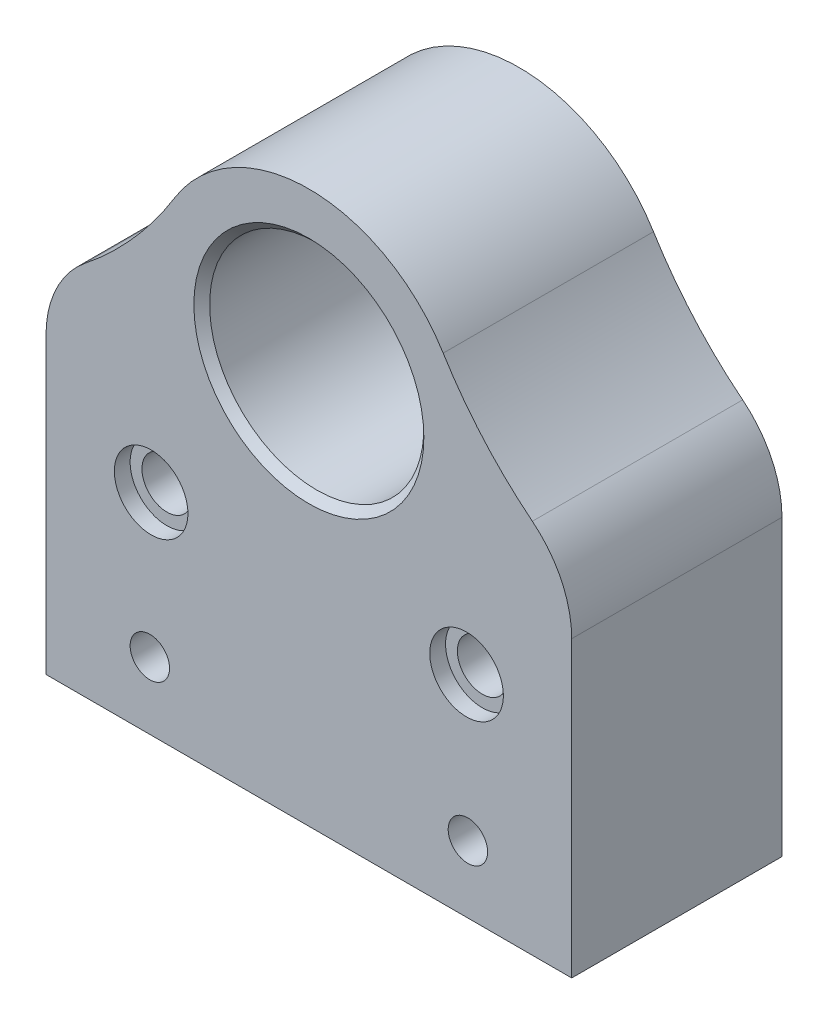
ISO-10303-21;
HEADER;
FILE_DESCRIPTION(('STEP AP214'),'2;1');
FILE_NAME('part.step','',(''),(''),'','','');
FILE_SCHEMA(('AUTOMOTIVE_DESIGN { 1 0 10303 214 1 1 1 1 }'));
ENDSEC;
DATA;
#1=APPLICATION_CONTEXT('core data for automotive mechanical design processes');
#2=APPLICATION_PROTOCOL_DEFINITION('international standard','automotive_design',2000,#1);
#3=PRODUCT_CONTEXT('',#1,'mechanical');
#4=PRODUCT('Part','Part','',(#3));
#5=PRODUCT_RELATED_PRODUCT_CATEGORY('part','',(#4));
#6=PRODUCT_DEFINITION_FORMATION('','',#4);
#7=PRODUCT_DEFINITION_CONTEXT('part definition',#1,'design');
#8=PRODUCT_DEFINITION('design','',#6,#7);
#9=PRODUCT_DEFINITION_SHAPE('','',#8);
#10=(LENGTH_UNIT() NAMED_UNIT(*) SI_UNIT(.MILLI.,.METRE.));
#11=(NAMED_UNIT(*) PLANE_ANGLE_UNIT() SI_UNIT($,.RADIAN.));
#12=(NAMED_UNIT(*) SI_UNIT($,.STERADIAN.) SOLID_ANGLE_UNIT());
#13=UNCERTAINTY_MEASURE_WITH_UNIT(LENGTH_MEASURE(1.E-05),#10,'distance_accuracy_value','');
#14=(GEOMETRIC_REPRESENTATION_CONTEXT(3) GLOBAL_UNCERTAINTY_ASSIGNED_CONTEXT((#13)) GLOBAL_UNIT_ASSIGNED_CONTEXT((#10,
#11,#12)) REPRESENTATION_CONTEXT('',''));
#15=CARTESIAN_POINT('',(0.,0.,0.));
#16=DIRECTION('',(0.,0.,1.));
#17=DIRECTION('',(1.,0.,0.));
#18=AXIS2_PLACEMENT_3D('',#15,#16,#17);
#19=CARTESIAN_POINT('',(0.,0.,4.8));
#20=DIRECTION('',(0.,0.,-1.));
#21=DIRECTION('',(0.,1.,0.));
#22=AXIS2_PLACEMENT_3D('',#19,#20,#21);
#23=CONICAL_SURFACE('',#22,4.075,0.785398163397446);
#24=CARTESIAN_POINT('',(0.,0.,4.8));
#25=DIRECTION('',(0.,0.,-1.));
#26=DIRECTION('',(0.,1.,0.));
#27=AXIS2_PLACEMENT_3D('',#24,#25,#26);
#28=CIRCLE('',#27,4.075);
#29=CARTESIAN_POINT('',(0.,4.075,4.8));
#30=VERTEX_POINT('',#29);
#31=EDGE_CURVE('E227',#30,#30,#28,.T.);
#32=ORIENTED_EDGE('',*,*,#31,.F.);
#33=EDGE_LOOP('',(#32));
#34=FACE_BOUND('',#33,.T.);
#35=CARTESIAN_POINT('',(0.,0.,4.5));
#36=DIRECTION('',(0.,0.,1.));
#37=DIRECTION('',(0.,1.,0.));
#38=AXIS2_PLACEMENT_3D('',#35,#36,#37);
#39=CIRCLE('',#38,4.375);
#40=CARTESIAN_POINT('',(0.,4.375,4.5));
#41=VERTEX_POINT('',#40);
#42=EDGE_CURVE('E185',#41,#41,#39,.T.);
#43=ORIENTED_EDGE('',*,*,#42,.F.);
#44=EDGE_LOOP('',(#43));
#45=FACE_BOUND('',#44,.T.);
#46=ADVANCED_FACE('F17',(#34,#45),#23,.F.);
#47=CARTESIAN_POINT('',(0.,0.,12.2));
#48=DIRECTION('',(0.,0.,1.));
#49=DIRECTION('',(0.,-1.,0.));
#50=AXIS2_PLACEMENT_3D('',#47,#48,#49);
#51=CONICAL_SURFACE('',#50,4.075,0.785398163397451);
#52=CARTESIAN_POINT('',(0.,0.,12.2));
#53=DIRECTION('',(0.,0.,1.));
#54=DIRECTION('',(0.,-1.,0.));
#55=AXIS2_PLACEMENT_3D('',#52,#53,#54);
#56=CIRCLE('',#55,4.075);
#57=CARTESIAN_POINT('',(0.,-4.075,12.2));
#58=VERTEX_POINT('',#57);
#59=EDGE_CURVE('E246',#58,#58,#56,.T.);
#60=ORIENTED_EDGE('',*,*,#59,.F.);
#61=EDGE_LOOP('',(#60));
#62=FACE_BOUND('',#61,.T.);
#63=CARTESIAN_POINT('',(0.,0.,12.5));
#64=DIRECTION('',(0.,0.,-1.));
#65=DIRECTION('',(0.,-1.,0.));
#66=AXIS2_PLACEMENT_3D('',#63,#64,#65);
#67=CIRCLE('',#66,4.375);
#68=CARTESIAN_POINT('',(0.,-4.375,12.5));
#69=VERTEX_POINT('',#68);
#70=EDGE_CURVE('E251',#69,#69,#67,.T.);
#71=ORIENTED_EDGE('',*,*,#70,.F.);
#72=EDGE_LOOP('',(#71));
#73=FACE_BOUND('',#72,.T.);
#74=ADVANCED_FACE('F374',(#62,#73),#51,.F.);
#75=CARTESIAN_POINT('',(-6.,-3.82101635651144,8.5));
#76=DIRECTION('',(0.,0.,1.));
#77=DIRECTION('',(0.,-1.,0.));
#78=AXIS2_PLACEMENT_3D('',#75,#76,#77);
#79=CYLINDRICAL_SURFACE('',#78,4.);
#80=CARTESIAN_POINT('',(-6.,-3.82101635651145,12.5));
#81=DIRECTION('',(0.,0.,1.));
#82=DIRECTION('',(0.,-1.,0.));
#83=AXIS2_PLACEMENT_3D('',#80,#81,#82);
#84=CIRCLE('',#83,4.);
#85=CARTESIAN_POINT('',(-8.50285133052596,-0.700802386719563,12.5));
#86=VERTEX_POINT('',#85);
#87=CARTESIAN_POINT('',(-10.,-3.82101635651144,12.5));
#88=VERTEX_POINT('',#87);
#89=EDGE_CURVE('E286',#86,#88,#84,.T.);
#90=ORIENTED_EDGE('',*,*,#89,.F.);
#91=DIRECTION('',(0.,0.,1.));
#92=VECTOR('',#91,1.);
#93=CARTESIAN_POINT('',(-8.50285133052596,-0.700802386719565,8.5));
#94=LINE('',#93,#92);
#95=CARTESIAN_POINT('',(-8.50285133052596,-0.700802386719561,4.5));
#96=VERTEX_POINT('',#95);
#97=EDGE_CURVE('E11',#96,#86,#94,.T.);
#98=ORIENTED_EDGE('',*,*,#97,.F.);
#99=CARTESIAN_POINT('',(-6.,-3.82101635651144,4.5));
#100=DIRECTION('',(0.,0.,-1.));
#101=DIRECTION('',(0.,1.,0.));
#102=AXIS2_PLACEMENT_3D('',#99,#100,#101);
#103=CIRCLE('',#102,4.);
#104=CARTESIAN_POINT('',(-10.,-3.82101635651144,4.5));
#105=VERTEX_POINT('',#104);
#106=EDGE_CURVE('E202',#105,#96,#103,.T.);
#107=ORIENTED_EDGE('',*,*,#106,.F.);
#108=DIRECTION('',(0.,0.,-1.));
#109=VECTOR('',#108,1.);
#110=CARTESIAN_POINT('',(-10.,-3.82101635651144,8.5));
#111=LINE('',#110,#109);
#112=EDGE_CURVE('E247',#88,#105,#111,.T.);
#113=ORIENTED_EDGE('',*,*,#112,.F.);
#114=EDGE_LOOP('',(#90,#98,#107,#113));
#115=FACE_BOUND('',#114,.T.);
#116=ADVANCED_FACE('F360',(#115),#79,.T.);
#117=CARTESIAN_POINT('',(6.,-3.82101635651144,8.5));
#118=DIRECTION('',(0.,0.,1.));
#119=DIRECTION('',(0.,-1.,0.));
#120=AXIS2_PLACEMENT_3D('',#117,#118,#119);
#121=CYLINDRICAL_SURFACE('',#120,4.);
#122=CARTESIAN_POINT('',(6.,-3.82101635651144,4.5));
#123=DIRECTION('',(0.,0.,-1.));
#124=DIRECTION('',(0.,1.,0.));
#125=AXIS2_PLACEMENT_3D('',#122,#123,#124);
#126=CIRCLE('',#125,4.);
#127=CARTESIAN_POINT('',(8.50285133052596,-0.700802386719563,4.5));
#128=VERTEX_POINT('',#127);
#129=CARTESIAN_POINT('',(10.,-3.82101635651144,4.5));
#130=VERTEX_POINT('',#129);
#131=EDGE_CURVE('E219',#128,#130,#126,.T.);
#132=ORIENTED_EDGE('',*,*,#131,.F.);
#133=DIRECTION('',(0.,0.,-1.));
#134=VECTOR('',#133,1.);
#135=CARTESIAN_POINT('',(8.50285133052596,-0.700802386719565,8.5));
#136=LINE('',#135,#134);
#137=CARTESIAN_POINT('',(8.50285133052596,-0.700802386719563,12.5));
#138=VERTEX_POINT('',#137);
#139=EDGE_CURVE('E25',#138,#128,#136,.T.);
#140=ORIENTED_EDGE('',*,*,#139,.F.);
#141=CARTESIAN_POINT('',(6.,-3.82101635651145,12.5));
#142=DIRECTION('',(0.,0.,1.));
#143=DIRECTION('',(0.,-1.,0.));
#144=AXIS2_PLACEMENT_3D('',#141,#142,#143);
#145=CIRCLE('',#144,4.);
#146=CARTESIAN_POINT('',(10.,-3.82101635651144,12.5));
#147=VERTEX_POINT('',#146);
#148=EDGE_CURVE('E270',#147,#138,#145,.T.);
#149=ORIENTED_EDGE('',*,*,#148,.F.);
#150=DIRECTION('',(0.,0.,1.));
#151=VECTOR('',#150,1.);
#152=CARTESIAN_POINT('',(10.,-3.82101635651145,12.5));
#153=LINE('',#152,#151);
#154=EDGE_CURVE('E243',#130,#147,#153,.T.);
#155=ORIENTED_EDGE('',*,*,#154,.F.);
#156=EDGE_LOOP('',(#132,#140,#149,#155));
#157=FACE_BOUND('',#156,.T.);
#158=ADVANCED_FACE('F332',(#157),#121,.T.);
#159=CARTESIAN_POINT('',(-17.8885438199983,11.,8.5));
#160=DIRECTION('',(0.,0.,1.));
#161=DIRECTION('',(0.,-1.,0.));
#162=AXIS2_PLACEMENT_3D('',#159,#160,#161);
#163=CYLINDRICAL_SURFACE('',#162,15.);
#164=CARTESIAN_POINT('',(-17.8885438199983,11.,4.5));
#165=DIRECTION('',(0.,0.,1.));
#166=DIRECTION('',(0.,1.,0.));
#167=AXIS2_PLACEMENT_3D('',#164,#165,#166);
#168=CIRCLE('',#167,15.);
#169=CARTESIAN_POINT('',(-5.11101251999952,3.14285714285715,4.5));
#170=VERTEX_POINT('',#169);
#171=EDGE_CURVE('E206',#96,#170,#168,.T.);
#172=ORIENTED_EDGE('',*,*,#171,.F.);
#173=ORIENTED_EDGE('',*,*,#97,.T.);
#174=CARTESIAN_POINT('',(-17.8885438199983,11.,12.5));
#175=DIRECTION('',(0.,0.,-1.));
#176=DIRECTION('',(0.,-1.,0.));
#177=AXIS2_PLACEMENT_3D('',#174,#175,#176);
#178=CIRCLE('',#177,15.);
#179=CARTESIAN_POINT('',(-5.11101251999952,3.14285714285715,12.5));
#180=VERTEX_POINT('',#179);
#181=EDGE_CURVE('E282',#180,#86,#178,.T.);
#182=ORIENTED_EDGE('',*,*,#181,.F.);
#183=DIRECTION('',(0.,0.,1.));
#184=VECTOR('',#183,1.);
#185=CARTESIAN_POINT('',(-5.11101251999952,3.14285714285715,8.5));
#186=LINE('',#185,#184);
#187=EDGE_CURVE('E226',#170,#180,#186,.T.);
#188=ORIENTED_EDGE('',*,*,#187,.F.);
#189=EDGE_LOOP('',(#172,#173,#182,#188));
#190=FACE_BOUND('',#189,.T.);
#191=ADVANCED_FACE('F362',(#190),#163,.F.);
#192=CARTESIAN_POINT('',(17.8885438199983,11.,8.5));
#193=DIRECTION('',(0.,0.,1.));
#194=DIRECTION('',(0.,-1.,0.));
#195=AXIS2_PLACEMENT_3D('',#192,#193,#194);
#196=CYLINDRICAL_SURFACE('',#195,15.);
#197=CARTESIAN_POINT('',(17.8885438199983,11.,12.5));
#198=DIRECTION('',(0.,0.,-1.));
#199=DIRECTION('',(0.,-1.,0.));
#200=AXIS2_PLACEMENT_3D('',#197,#198,#199);
#201=CIRCLE('',#200,15.);
#202=CARTESIAN_POINT('',(5.11101251999952,3.14285714285715,12.5));
#203=VERTEX_POINT('',#202);
#204=EDGE_CURVE('E274',#138,#203,#201,.T.);
#205=ORIENTED_EDGE('',*,*,#204,.F.);
#206=ORIENTED_EDGE('',*,*,#139,.T.);
#207=CARTESIAN_POINT('',(17.8885438199983,11.,4.5));
#208=DIRECTION('',(0.,0.,1.));
#209=DIRECTION('',(0.,1.,0.));
#210=AXIS2_PLACEMENT_3D('',#207,#208,#209);
#211=CIRCLE('',#210,15.);
#212=CARTESIAN_POINT('',(5.11101251999952,3.14285714285715,4.5));
#213=VERTEX_POINT('',#212);
#214=EDGE_CURVE('E210',#213,#128,#211,.T.);
#215=ORIENTED_EDGE('',*,*,#214,.F.);
#216=DIRECTION('',(0.,0.,-1.));
#217=VECTOR('',#216,1.);
#218=CARTESIAN_POINT('',(5.11101251999952,3.14285714285715,8.5));
#219=LINE('',#218,#217);
#220=EDGE_CURVE('E223',#203,#213,#219,.T.);
#221=ORIENTED_EDGE('',*,*,#220,.F.);
#222=EDGE_LOOP('',(#205,#206,#215,#221));
#223=FACE_BOUND('',#222,.T.);
#224=ADVANCED_FACE('F329',(#223),#196,.F.);
#225=CARTESIAN_POINT('',(6.,-7.,12.5));
#226=DIRECTION('',(0.,0.,-1.));
#227=DIRECTION('',(0.,1.,0.));
#228=AXIS2_PLACEMENT_3D('',#225,#226,#227);
#229=CYLINDRICAL_SURFACE('',#228,1.4);
#230=CARTESIAN_POINT('',(6.,-7.,12.5));
#231=DIRECTION('',(0.,0.,-1.));
#232=DIRECTION('',(0.,1.,0.));
#233=AXIS2_PLACEMENT_3D('',#230,#231,#232);
#234=CIRCLE('',#233,1.4);
#235=CARTESIAN_POINT('',(6.,-5.6,12.5));
#236=VERTEX_POINT('',#235);
#237=EDGE_CURVE('E254',#236,#236,#234,.T.);
#238=ORIENTED_EDGE('',*,*,#237,.F.);
#239=EDGE_LOOP('',(#238));
#240=FACE_BOUND('',#239,.T.);
#241=CARTESIAN_POINT('',(6.,-7.,11.9));
#242=DIRECTION('',(0.,0.,-1.));
#243=DIRECTION('',(0.,1.,0.));
#244=AXIS2_PLACEMENT_3D('',#241,#242,#243);
#245=CIRCLE('',#244,1.4);
#246=CARTESIAN_POINT('',(6.,-5.6,11.9));
#247=VERTEX_POINT('',#246);
#248=EDGE_CURVE('E35',#247,#247,#245,.T.);
#249=ORIENTED_EDGE('',*,*,#248,.T.);
#250=EDGE_LOOP('',(#249));
#251=FACE_BOUND('',#250,.T.);
#252=ADVANCED_FACE('F370',(#240,#251),#229,.F.);
#253=CARTESIAN_POINT('',(7.4,-7.,11.9));
#254=DIRECTION('',(0.,0.,1.));
#255=DIRECTION('',(0.,-1.,0.));
#256=AXIS2_PLACEMENT_3D('',#253,#254,#255);
#257=PLANE('',#256);
#258=ORIENTED_EDGE('',*,*,#248,.F.);
#259=EDGE_LOOP('',(#258));
#260=FACE_BOUND('',#259,.T.);
#261=CARTESIAN_POINT('',(6.,-7.,11.9));
#262=DIRECTION('',(0.,0.,-1.));
#263=DIRECTION('',(0.,1.,0.));
#264=AXIS2_PLACEMENT_3D('',#261,#262,#263);
#265=CIRCLE('',#264,0.95);
#266=CARTESIAN_POINT('',(6.,-6.05,11.9));
#267=VERTEX_POINT('',#266);
#268=EDGE_CURVE('E42',#267,#267,#265,.T.);
#269=ORIENTED_EDGE('',*,*,#268,.T.);
#270=EDGE_LOOP('',(#269));
#271=FACE_BOUND('',#270,.T.);
#272=ADVANCED_FACE('F412',(#260,#271),#257,.T.);
#273=CARTESIAN_POINT('',(6.,-7.,12.5));
#274=DIRECTION('',(0.,0.,-1.));
#275=DIRECTION('',(0.,1.,0.));
#276=AXIS2_PLACEMENT_3D('',#273,#274,#275);
#277=CYLINDRICAL_SURFACE('',#276,0.95);
#278=ORIENTED_EDGE('',*,*,#268,.F.);
#279=EDGE_LOOP('',(#278));
#280=FACE_BOUND('',#279,.T.);
#281=CARTESIAN_POINT('',(6.,-7.,4.5));
#282=DIRECTION('',(0.,0.,-1.));
#283=DIRECTION('',(0.,1.,0.));
#284=AXIS2_PLACEMENT_3D('',#281,#282,#283);
#285=CIRCLE('',#284,0.95);
#286=CARTESIAN_POINT('',(6.,-6.05,4.5));
#287=VERTEX_POINT('',#286);
#288=EDGE_CURVE('E180',#287,#287,#285,.T.);
#289=ORIENTED_EDGE('',*,*,#288,.T.);
#290=EDGE_LOOP('',(#289));
#291=FACE_BOUND('',#290,.T.);
#292=ADVANCED_FACE('F181',(#280,#291),#277,.F.);
#293=CARTESIAN_POINT('',(-6.,-7.,12.5));
#294=DIRECTION('',(0.,0.,-1.));
#295=DIRECTION('',(0.,1.,0.));
#296=AXIS2_PLACEMENT_3D('',#293,#294,#295);
#297=CYLINDRICAL_SURFACE('',#296,1.4);
#298=CARTESIAN_POINT('',(-6.,-7.,12.5));
#299=DIRECTION('',(0.,0.,-1.));
#300=DIRECTION('',(0.,1.,0.));
#301=AXIS2_PLACEMENT_3D('',#298,#299,#300);
#302=CIRCLE('',#301,1.4);
#303=CARTESIAN_POINT('',(-6.,-5.6,12.5));
#304=VERTEX_POINT('',#303);
#305=EDGE_CURVE('E238',#304,#304,#302,.T.);
#306=ORIENTED_EDGE('',*,*,#305,.F.);
#307=EDGE_LOOP('',(#306));
#308=FACE_BOUND('',#307,.T.);
#309=CARTESIAN_POINT('',(-6.,-7.,11.9));
#310=DIRECTION('',(0.,0.,-1.));
#311=DIRECTION('',(0.,1.,0.));
#312=AXIS2_PLACEMENT_3D('',#309,#310,#311);
#313=CIRCLE('',#312,1.4);
#314=CARTESIAN_POINT('',(-6.,-5.6,11.9));
#315=VERTEX_POINT('',#314);
#316=EDGE_CURVE('E319',#315,#315,#313,.T.);
#317=ORIENTED_EDGE('',*,*,#316,.T.);
#318=EDGE_LOOP('',(#317));
#319=FACE_BOUND('',#318,.T.);
#320=ADVANCED_FACE('F411',(#308,#319),#297,.F.);
#321=CARTESIAN_POINT('',(-4.6,-7.,11.9));
#322=DIRECTION('',(0.,0.,1.));
#323=DIRECTION('',(0.,-1.,0.));
#324=AXIS2_PLACEMENT_3D('',#321,#322,#323);
#325=PLANE('',#324);
#326=ORIENTED_EDGE('',*,*,#316,.F.);
#327=EDGE_LOOP('',(#326));
#328=FACE_BOUND('',#327,.T.);
#329=CARTESIAN_POINT('',(-6.,-7.,11.9));
#330=DIRECTION('',(0.,0.,-1.));
#331=DIRECTION('',(0.,1.,0.));
#332=AXIS2_PLACEMENT_3D('',#329,#330,#331);
#333=CIRCLE('',#332,0.95);
#334=CARTESIAN_POINT('',(-6.,-6.05,11.9));
#335=VERTEX_POINT('',#334);
#336=EDGE_CURVE('E316',#335,#335,#333,.T.);
#337=ORIENTED_EDGE('',*,*,#336,.T.);
#338=EDGE_LOOP('',(#337));
#339=FACE_BOUND('',#338,.T.);
#340=ADVANCED_FACE('F429',(#328,#339),#325,.T.);
#341=CARTESIAN_POINT('',(-6.,-7.,12.5));
#342=DIRECTION('',(0.,0.,-1.));
#343=DIRECTION('',(0.,1.,0.));
#344=AXIS2_PLACEMENT_3D('',#341,#342,#343);
#345=CYLINDRICAL_SURFACE('',#344,0.95);
#346=ORIENTED_EDGE('',*,*,#336,.F.);
#347=EDGE_LOOP('',(#346));
#348=FACE_BOUND('',#347,.T.);
#349=CARTESIAN_POINT('',(-6.,-7.,4.5));
#350=DIRECTION('',(0.,0.,-1.));
#351=DIRECTION('',(0.,1.,0.));
#352=AXIS2_PLACEMENT_3D('',#349,#350,#351);
#353=CIRCLE('',#352,0.95);
#354=CARTESIAN_POINT('',(-6.,-6.05,4.5));
#355=VERTEX_POINT('',#354);
#356=EDGE_CURVE('E184',#355,#355,#353,.T.);
#357=ORIENTED_EDGE('',*,*,#356,.T.);
#358=EDGE_LOOP('',(#357));
#359=FACE_BOUND('',#358,.T.);
#360=ADVANCED_FACE('F432',(#348,#359),#345,.F.);
#361=CARTESIAN_POINT('',(-6.05,-12.45,4.5));
#362=DIRECTION('',(0.,0.,1.));
#363=DIRECTION('',(0.,-1.,0.));
#364=AXIS2_PLACEMENT_3D('',#361,#362,#363);
#365=CYLINDRICAL_SURFACE('',#364,1.1);
#366=CARTESIAN_POINT('',(-6.05,-12.45,4.5));
#367=DIRECTION('',(0.,0.,1.));
#368=DIRECTION('',(0.,-1.,0.));
#369=AXIS2_PLACEMENT_3D('',#366,#367,#368);
#370=CIRCLE('',#369,1.1);
#371=CARTESIAN_POINT('',(-6.05,-13.55,4.5));
#372=VERTEX_POINT('',#371);
#373=EDGE_CURVE('E190',#372,#372,#370,.T.);
#374=ORIENTED_EDGE('',*,*,#373,.F.);
#375=EDGE_LOOP('',(#374));
#376=FACE_BOUND('',#375,.T.);
#377=CARTESIAN_POINT('',(-6.05,-12.45,5.1));
#378=DIRECTION('',(0.,0.,1.));
#379=DIRECTION('',(0.,-1.,0.));
#380=AXIS2_PLACEMENT_3D('',#377,#378,#379);
#381=CIRCLE('',#380,1.1);
#382=CARTESIAN_POINT('',(-6.05,-13.55,5.1));
#383=VERTEX_POINT('',#382);
#384=EDGE_CURVE('E313',#383,#383,#381,.T.);
#385=ORIENTED_EDGE('',*,*,#384,.T.);
#386=EDGE_LOOP('',(#385));
#387=FACE_BOUND('',#386,.T.);
#388=ADVANCED_FACE('F427',(#376,#387),#365,.F.);
#389=CARTESIAN_POINT('',(-4.95,-12.45,5.1));
#390=DIRECTION('',(0.,0.,-1.));
#391=DIRECTION('',(-1.,0.,0.));
#392=AXIS2_PLACEMENT_3D('',#389,#390,#391);
#393=PLANE('',#392);
#394=ORIENTED_EDGE('',*,*,#384,.F.);
#395=EDGE_LOOP('',(#394));
#396=FACE_BOUND('',#395,.T.);
#397=CARTESIAN_POINT('',(-6.05,-12.45,5.1));
#398=DIRECTION('',(0.,0.,1.));
#399=DIRECTION('',(0.,-1.,0.));
#400=AXIS2_PLACEMENT_3D('',#397,#398,#399);
#401=CIRCLE('',#400,0.75);
#402=CARTESIAN_POINT('',(-6.05,-13.2,5.1));
#403=VERTEX_POINT('',#402);
#404=EDGE_CURVE('E308',#403,#403,#401,.T.);
#405=ORIENTED_EDGE('',*,*,#404,.T.);
#406=EDGE_LOOP('',(#405));
#407=FACE_BOUND('',#406,.T.);
#408=ADVANCED_FACE('F423',(#396,#407),#393,.T.);
#409=CARTESIAN_POINT('',(-6.05,-12.45,4.5));
#410=DIRECTION('',(0.,0.,1.));
#411=DIRECTION('',(0.,-1.,0.));
#412=AXIS2_PLACEMENT_3D('',#409,#410,#411);
#413=CYLINDRICAL_SURFACE('',#412,0.75);
#414=ORIENTED_EDGE('',*,*,#404,.F.);
#415=EDGE_LOOP('',(#414));
#416=FACE_BOUND('',#415,.T.);
#417=CARTESIAN_POINT('',(-6.05,-12.45,12.5));
#418=DIRECTION('',(0.,0.,1.));
#419=DIRECTION('',(0.,-1.,0.));
#420=AXIS2_PLACEMENT_3D('',#417,#418,#419);
#421=CIRCLE('',#420,0.75);
#422=CARTESIAN_POINT('',(-6.05,-13.2,12.5));
#423=VERTEX_POINT('',#422);
#424=EDGE_CURVE('E234',#423,#423,#421,.T.);
#425=ORIENTED_EDGE('',*,*,#424,.T.);
#426=EDGE_LOOP('',(#425));
#427=FACE_BOUND('',#426,.T.);
#428=ADVANCED_FACE('F419',(#416,#427),#413,.F.);
#429=CARTESIAN_POINT('',(6.05,-12.45,4.5));
#430=DIRECTION('',(0.,0.,1.));
#431=DIRECTION('',(0.,-1.,0.));
#432=AXIS2_PLACEMENT_3D('',#429,#430,#431);
#433=CYLINDRICAL_SURFACE('',#432,1.1);
#434=CARTESIAN_POINT('',(6.05,-12.45,4.5));
#435=DIRECTION('',(0.,0.,1.));
#436=DIRECTION('',(0.,-1.,0.));
#437=AXIS2_PLACEMENT_3D('',#434,#435,#436);
#438=CIRCLE('',#437,1.1);
#439=CARTESIAN_POINT('',(6.05,-13.55,4.5));
#440=VERTEX_POINT('',#439);
#441=EDGE_CURVE('E207',#440,#440,#438,.T.);
#442=ORIENTED_EDGE('',*,*,#441,.F.);
#443=EDGE_LOOP('',(#442));
#444=FACE_BOUND('',#443,.T.);
#445=CARTESIAN_POINT('',(6.05,-12.45,5.1));
#446=DIRECTION('',(0.,0.,1.));
#447=DIRECTION('',(0.,-1.,0.));
#448=AXIS2_PLACEMENT_3D('',#445,#446,#447);
#449=CIRCLE('',#448,1.1);
#450=CARTESIAN_POINT('',(6.05,-13.55,5.1));
#451=VERTEX_POINT('',#450);
#452=EDGE_CURVE('E305',#451,#451,#449,.T.);
#453=ORIENTED_EDGE('',*,*,#452,.T.);
#454=EDGE_LOOP('',(#453));
#455=FACE_BOUND('',#454,.T.);
#456=ADVANCED_FACE('F404',(#444,#455),#433,.F.);
#457=CARTESIAN_POINT('',(7.15,-12.45,5.1));
#458=DIRECTION('',(0.,0.,-1.));
#459=DIRECTION('',(-1.,0.,0.));
#460=AXIS2_PLACEMENT_3D('',#457,#458,#459);
#461=PLANE('',#460);
#462=ORIENTED_EDGE('',*,*,#452,.F.);
#463=EDGE_LOOP('',(#462));
#464=FACE_BOUND('',#463,.T.);
#465=CARTESIAN_POINT('',(6.05,-12.45,5.1));
#466=DIRECTION('',(0.,0.,1.));
#467=DIRECTION('',(0.,-1.,0.));
#468=AXIS2_PLACEMENT_3D('',#465,#466,#467);
#469=CIRCLE('',#468,0.75);
#470=CARTESIAN_POINT('',(6.05,-13.2,5.1));
#471=VERTEX_POINT('',#470);
#472=EDGE_CURVE('E261',#471,#471,#469,.T.);
#473=ORIENTED_EDGE('',*,*,#472,.T.);
#474=EDGE_LOOP('',(#473));
#475=FACE_BOUND('',#474,.T.);
#476=ADVANCED_FACE('F401',(#464,#475),#461,.T.);
#477=CARTESIAN_POINT('',(6.05,-12.45,4.5));
#478=DIRECTION('',(0.,0.,1.));
#479=DIRECTION('',(0.,-1.,0.));
#480=AXIS2_PLACEMENT_3D('',#477,#478,#479);
#481=CYLINDRICAL_SURFACE('',#480,0.75);
#482=ORIENTED_EDGE('',*,*,#472,.F.);
#483=EDGE_LOOP('',(#482));
#484=FACE_BOUND('',#483,.T.);
#485=CARTESIAN_POINT('',(6.05,-12.45,12.5));
#486=DIRECTION('',(0.,0.,1.));
#487=DIRECTION('',(0.,-1.,0.));
#488=AXIS2_PLACEMENT_3D('',#485,#486,#487);
#489=CIRCLE('',#488,0.75);
#490=CARTESIAN_POINT('',(6.05,-13.2,12.5));
#491=VERTEX_POINT('',#490);
#492=EDGE_CURVE('E237',#491,#491,#489,.T.);
#493=ORIENTED_EDGE('',*,*,#492,.T.);
#494=EDGE_LOOP('',(#493));
#495=FACE_BOUND('',#494,.T.);
#496=ADVANCED_FACE('F394',(#484,#495),#481,.F.);
#497=CARTESIAN_POINT('',(0.,0.,8.5));
#498=DIRECTION('',(0.,0.,1.));
#499=DIRECTION('',(0.,-1.,0.));
#500=AXIS2_PLACEMENT_3D('',#497,#498,#499);
#501=CYLINDRICAL_SURFACE('',#500,6.);
#502=CARTESIAN_POINT('',(0.,0.,12.5));
#503=DIRECTION('',(0.,0.,1.));
#504=DIRECTION('',(0.,-1.,0.));
#505=AXIS2_PLACEMENT_3D('',#502,#503,#504);
#506=CIRCLE('',#505,6.);
#507=EDGE_CURVE('E278',#203,#180,#506,.T.);
#508=ORIENTED_EDGE('',*,*,#507,.F.);
#509=ORIENTED_EDGE('',*,*,#220,.T.);
#510=CARTESIAN_POINT('',(0.,0.,4.5));
#511=DIRECTION('',(0.,0.,-1.));
#512=DIRECTION('',(0.,1.,0.));
#513=AXIS2_PLACEMENT_3D('',#510,#511,#512);
#514=CIRCLE('',#513,6.);
#515=EDGE_CURVE('E242',#170,#213,#514,.T.);
#516=ORIENTED_EDGE('',*,*,#515,.F.);
#517=ORIENTED_EDGE('',*,*,#187,.T.);
#518=EDGE_LOOP('',(#508,#509,#516,#517));
#519=FACE_BOUND('',#518,.T.);
#520=ADVANCED_FACE('F341',(#519),#501,.T.);
#521=CARTESIAN_POINT('',(0.,0.,-12.5));
#522=DIRECTION('',(0.,0.,1.));
#523=DIRECTION('',(0.,-1.,0.));
#524=AXIS2_PLACEMENT_3D('',#521,#522,#523);
#525=CYLINDRICAL_SURFACE('',#524,4.075);
#526=ORIENTED_EDGE('',*,*,#31,.T.);
#527=EDGE_LOOP('',(#526));
#528=FACE_BOUND('',#527,.T.);
#529=ORIENTED_EDGE('',*,*,#59,.T.);
#530=EDGE_LOOP('',(#529));
#531=FACE_BOUND('',#530,.T.);
#532=ADVANCED_FACE('F393',(#528,#531),#525,.F.);
#533=CARTESIAN_POINT('',(10.,-20.675,8.5));
#534=DIRECTION('',(1.,0.,0.));
#535=DIRECTION('',(0.,1.,0.));
#536=AXIS2_PLACEMENT_3D('',#533,#534,#535);
#537=PLANE('',#536);
#538=DIRECTION('',(0.,-1.,0.));
#539=VECTOR('',#538,1.);
#540=CARTESIAN_POINT('',(10.,-9.5,4.5));
#541=LINE('',#540,#539);
#542=CARTESIAN_POINT('',(10.,-15.,4.5));
#543=VERTEX_POINT('',#542);
#544=EDGE_CURVE('E201',#130,#543,#541,.T.);
#545=ORIENTED_EDGE('',*,*,#544,.F.);
#546=ORIENTED_EDGE('',*,*,#154,.T.);
#547=DIRECTION('',(0.,1.,0.));
#548=VECTOR('',#547,1.);
#549=CARTESIAN_POINT('',(10.,-9.5,12.5));
#550=LINE('',#549,#548);
#551=CARTESIAN_POINT('',(10.,-15.,12.5));
#552=VERTEX_POINT('',#551);
#553=EDGE_CURVE('E266',#552,#147,#550,.T.);
#554=ORIENTED_EDGE('',*,*,#553,.F.);
#555=DIRECTION('',(0.,0.,-1.));
#556=VECTOR('',#555,1.);
#557=CARTESIAN_POINT('',(10.,-15.,8.5));
#558=LINE('',#557,#556);
#559=EDGE_CURVE('E214',#552,#543,#558,.T.);
#560=ORIENTED_EDGE('',*,*,#559,.T.);
#561=EDGE_LOOP('',(#545,#546,#554,#560));
#562=FACE_BOUND('',#561,.T.);
#563=ADVANCED_FACE('F350',(#562),#537,.T.);
#564=CARTESIAN_POINT('',(-10.,-20.675,8.5));
#565=DIRECTION('',(1.,0.,0.));
#566=DIRECTION('',(0.,1.,0.));
#567=AXIS2_PLACEMENT_3D('',#564,#565,#566);
#568=PLANE('',#567);
#569=DIRECTION('',(0.,1.,0.));
#570=VECTOR('',#569,1.);
#571=CARTESIAN_POINT('',(-10.,-9.5,12.5));
#572=LINE('',#571,#570);
#573=CARTESIAN_POINT('',(-10.,-15.,12.5));
#574=VERTEX_POINT('',#573);
#575=EDGE_CURVE('E290',#574,#88,#572,.T.);
#576=ORIENTED_EDGE('',*,*,#575,.T.);
#577=ORIENTED_EDGE('',*,*,#112,.T.);
#578=DIRECTION('',(0.,-1.,0.));
#579=VECTOR('',#578,1.);
#580=CARTESIAN_POINT('',(-10.,-9.5,4.5));
#581=LINE('',#580,#579);
#582=CARTESIAN_POINT('',(-10.,-15.,4.5));
#583=VERTEX_POINT('',#582);
#584=EDGE_CURVE('E200',#105,#583,#581,.T.);
#585=ORIENTED_EDGE('',*,*,#584,.T.);
#586=DIRECTION('',(0.,0.,-1.));
#587=VECTOR('',#586,1.);
#588=CARTESIAN_POINT('',(-10.,-15.,8.5));
#589=LINE('',#588,#587);
#590=EDGE_CURVE('E211',#574,#583,#589,.T.);
#591=ORIENTED_EDGE('',*,*,#590,.F.);
#592=EDGE_LOOP('',(#576,#577,#585,#591));
#593=FACE_BOUND('',#592,.T.);
#594=ADVANCED_FACE('F356',(#593),#568,.F.);
#595=CARTESIAN_POINT('',(6.,-15.,8.5));
#596=DIRECTION('',(0.,1.,0.));
#597=DIRECTION('',(0.,0.,-1.));
#598=AXIS2_PLACEMENT_3D('',#595,#596,#597);
#599=PLANE('',#598);
#600=DIRECTION('',(-1.,0.,0.));
#601=VECTOR('',#600,1.);
#602=CARTESIAN_POINT('',(6.,-15.,12.5));
#603=LINE('',#602,#601);
#604=EDGE_CURVE('E215',#552,#574,#603,.T.);
#605=ORIENTED_EDGE('',*,*,#604,.T.);
#606=ORIENTED_EDGE('',*,*,#590,.T.);
#607=DIRECTION('',(-1.,0.,0.));
#608=VECTOR('',#607,1.);
#609=CARTESIAN_POINT('',(6.,-15.,4.5));
#610=LINE('',#609,#608);
#611=EDGE_CURVE('E196',#543,#583,#610,.T.);
#612=ORIENTED_EDGE('',*,*,#611,.F.);
#613=ORIENTED_EDGE('',*,*,#559,.F.);
#614=EDGE_LOOP('',(#605,#606,#612,#613));
#615=FACE_BOUND('',#614,.T.);
#616=ADVANCED_FACE('F354',(#615),#599,.F.);
#617=CARTESIAN_POINT('',(6.,1.,12.5));
#618=DIRECTION('',(0.,0.,1.));
#619=DIRECTION('',(0.,-1.,0.));
#620=AXIS2_PLACEMENT_3D('',#617,#618,#619);
#621=PLANE('',#620);
#622=ORIENTED_EDGE('',*,*,#553,.T.);
#623=ORIENTED_EDGE('',*,*,#148,.T.);
#624=ORIENTED_EDGE('',*,*,#204,.T.);
#625=ORIENTED_EDGE('',*,*,#507,.T.);
#626=ORIENTED_EDGE('',*,*,#181,.T.);
#627=ORIENTED_EDGE('',*,*,#89,.T.);
#628=ORIENTED_EDGE('',*,*,#575,.F.);
#629=ORIENTED_EDGE('',*,*,#604,.F.);
#630=EDGE_LOOP('',(#622,#623,#624,#625,#626,#627,#628,#629));
#631=FACE_BOUND('',#630,.T.);
#632=ORIENTED_EDGE('',*,*,#492,.F.);
#633=EDGE_LOOP('',(#632));
#634=FACE_BOUND('',#633,.T.);
#635=ORIENTED_EDGE('',*,*,#424,.F.);
#636=EDGE_LOOP('',(#635));
#637=FACE_BOUND('',#636,.T.);
#638=ORIENTED_EDGE('',*,*,#305,.T.);
#639=EDGE_LOOP('',(#638));
#640=FACE_BOUND('',#639,.T.);
#641=ORIENTED_EDGE('',*,*,#237,.T.);
#642=EDGE_LOOP('',(#641));
#643=FACE_BOUND('',#642,.T.);
#644=ORIENTED_EDGE('',*,*,#70,.T.);
#645=EDGE_LOOP('',(#644));
#646=FACE_BOUND('',#645,.T.);
#647=ADVANCED_FACE('F344',(#631,#634,#637,#640,#643,#646),#621,.T.);
#648=CARTESIAN_POINT('',(6.,1.,4.5));
#649=DIRECTION('',(0.,0.,-1.));
#650=DIRECTION('',(-1.,0.,0.));
#651=AXIS2_PLACEMENT_3D('',#648,#649,#650);
#652=PLANE('',#651);
#653=ORIENTED_EDGE('',*,*,#214,.T.);
#654=ORIENTED_EDGE('',*,*,#131,.T.);
#655=ORIENTED_EDGE('',*,*,#544,.T.);
#656=ORIENTED_EDGE('',*,*,#611,.T.);
#657=ORIENTED_EDGE('',*,*,#584,.F.);
#658=ORIENTED_EDGE('',*,*,#106,.T.);
#659=ORIENTED_EDGE('',*,*,#171,.T.);
#660=ORIENTED_EDGE('',*,*,#515,.T.);
#661=EDGE_LOOP('',(#653,#654,#655,#656,#657,#658,#659,#660));
#662=FACE_BOUND('',#661,.T.);
#663=ORIENTED_EDGE('',*,*,#441,.T.);
#664=EDGE_LOOP('',(#663));
#665=FACE_BOUND('',#664,.T.);
#666=ORIENTED_EDGE('',*,*,#373,.T.);
#667=EDGE_LOOP('',(#666));
#668=FACE_BOUND('',#667,.T.);
#669=ORIENTED_EDGE('',*,*,#356,.F.);
#670=EDGE_LOOP('',(#669));
#671=FACE_BOUND('',#670,.T.);
#672=ORIENTED_EDGE('',*,*,#288,.F.);
#673=EDGE_LOOP('',(#672));
#674=FACE_BOUND('',#673,.T.);
#675=ORIENTED_EDGE('',*,*,#42,.T.);
#676=EDGE_LOOP('',(#675));
#677=FACE_BOUND('',#676,.T.);
#678=ADVANCED_FACE('F335',(#662,#665,#668,#671,#674,#677),#652,.T.);
#679=CLOSED_SHELL('',(#46,#74,#116,#158,#191,#224,#252,#272,#292,#320,#340,#360,#388,#408,#428,
#456,#476,#496,#520,#532,#563,#594,#616,#647,#678));
#680=MANIFOLD_SOLID_BREP('B1',#679);
#681=ADVANCED_BREP_SHAPE_REPRESENTATION('',(#18,#680),#14);
#682=SHAPE_DEFINITION_REPRESENTATION(#9,#681);
ENDSEC;
END-ISO-10303-21;
